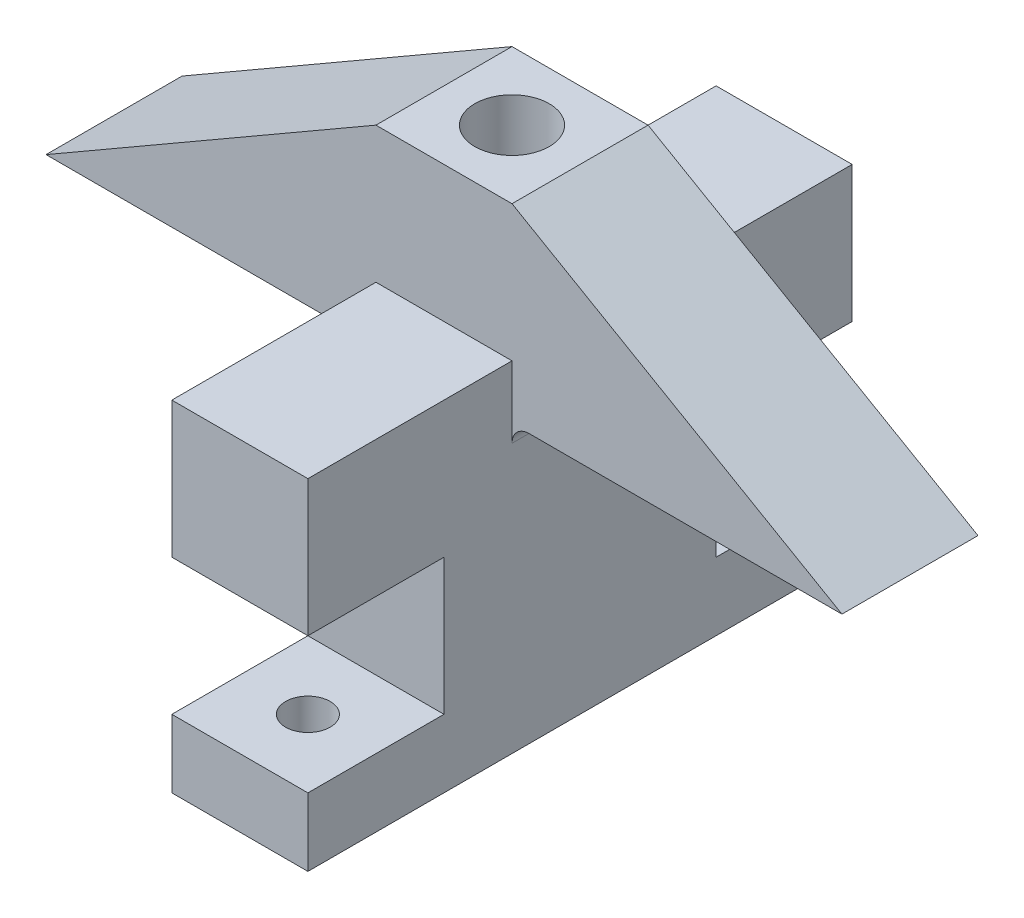
ISO-10303-21;
HEADER;
FILE_DESCRIPTION(('STEP AP214'),'2;1');
FILE_NAME('part.step','',(''),(''),'','','');
FILE_SCHEMA(('AUTOMOTIVE_DESIGN { 1 0 10303 214 1 1 1 1 }'));
ENDSEC;
DATA;
#1=APPLICATION_CONTEXT('core data for automotive mechanical design processes');
#2=APPLICATION_PROTOCOL_DEFINITION('international standard','automotive_design',2000,#1);
#3=PRODUCT_CONTEXT('',#1,'mechanical');
#4=PRODUCT('Part','Part','',(#3));
#5=PRODUCT_RELATED_PRODUCT_CATEGORY('part','',(#4));
#6=PRODUCT_DEFINITION_FORMATION('','',#4);
#7=PRODUCT_DEFINITION_CONTEXT('part definition',#1,'design');
#8=PRODUCT_DEFINITION('design','',#6,#7);
#9=PRODUCT_DEFINITION_SHAPE('','',#8);
#10=(LENGTH_UNIT() NAMED_UNIT(*) SI_UNIT(.MILLI.,.METRE.));
#11=(NAMED_UNIT(*) PLANE_ANGLE_UNIT() SI_UNIT($,.RADIAN.));
#12=(NAMED_UNIT(*) SI_UNIT($,.STERADIAN.) SOLID_ANGLE_UNIT());
#13=UNCERTAINTY_MEASURE_WITH_UNIT(LENGTH_MEASURE(1.E-05),#10,'distance_accuracy_value','');
#14=(GEOMETRIC_REPRESENTATION_CONTEXT(3) GLOBAL_UNCERTAINTY_ASSIGNED_CONTEXT((#13)) GLOBAL_UNIT_ASSIGNED_CONTEXT((#10,
#11,#12)) REPRESENTATION_CONTEXT('',''));
#15=CARTESIAN_POINT('',(0.,0.,0.));
#16=DIRECTION('',(0.,0.,1.));
#17=DIRECTION('',(1.,0.,0.));
#18=AXIS2_PLACEMENT_3D('',#15,#16,#17);
#19=CARTESIAN_POINT('',(0.,0.,0.));
#20=DIRECTION('',(0.,0.,-1.));
#21=DIRECTION('',(-1.,0.,0.));
#22=AXIS2_PLACEMENT_3D('',#19,#20,#21);
#23=PLANE('',#22);
#24=DIRECTION('',(-1.,0.,0.));
#25=VECTOR('',#24,1.);
#26=CARTESIAN_POINT('',(0.,63.5,0.));
#27=LINE('',#26,#25);
#28=CARTESIAN_POINT('',(25.4,63.5,0.));
#29=VERTEX_POINT('',#28);
#30=CARTESIAN_POINT('',(0.,63.5,0.));
#31=VERTEX_POINT('',#30);
#32=EDGE_CURVE('E59',#29,#31,#27,.T.);
#33=ORIENTED_EDGE('',*,*,#32,.T.);
#34=DIRECTION('',(0.,1.,0.));
#35=VECTOR('',#34,1.);
#36=CARTESIAN_POINT('',(0.,0.,0.));
#37=LINE('',#36,#35);
#38=CARTESIAN_POINT('',(0.,50.165,0.));
#39=VERTEX_POINT('',#38);
#40=EDGE_CURVE('E212',#39,#31,#37,.T.);
#41=ORIENTED_EDGE('',*,*,#40,.F.);
#42=CARTESIAN_POINT('',(-3.175,50.165,0.));
#43=DIRECTION('',(0.,0.,-1.));
#44=DIRECTION('',(-1.,0.,0.));
#45=AXIS2_PLACEMENT_3D('',#42,#43,#44);
#46=CIRCLE('',#45,3.175);
#47=CARTESIAN_POINT('',(-3.175,53.34,0.));
#48=VERTEX_POINT('',#47);
#49=EDGE_CURVE('E52',#39,#48,#46,.F.);
#50=ORIENTED_EDGE('',*,*,#49,.T.);
#51=DIRECTION('',(1.,0.,0.));
#52=VECTOR('',#51,1.);
#53=CARTESIAN_POINT('',(0.,53.34,0.));
#54=LINE('',#53,#52);
#55=CARTESIAN_POINT('',(-61.5917267171501,53.34,0.));
#56=VERTEX_POINT('',#55);
#57=EDGE_CURVE('E381',#56,#48,#54,.T.);
#58=ORIENTED_EDGE('',*,*,#57,.F.);
#59=DIRECTION('',(-0.866025403784441,-0.499999999999995,0.));
#60=VECTOR('',#59,1.);
#61=CARTESIAN_POINT('',(-61.5917267171501,53.34,0.));
#62=LINE('',#61,#60);
#63=CARTESIAN_POINT('',(0.,88.9,0.));
#64=VERTEX_POINT('',#63);
#65=EDGE_CURVE('E403',#64,#56,#62,.T.);
#66=ORIENTED_EDGE('',*,*,#65,.F.);
#67=DIRECTION('',(-1.,0.,0.));
#68=VECTOR('',#67,1.);
#69=CARTESIAN_POINT('',(0.,88.9,0.));
#70=LINE('',#69,#68);
#71=CARTESIAN_POINT('',(25.4,88.9,0.));
#72=VERTEX_POINT('',#71);
#73=EDGE_CURVE('E400',#72,#64,#70,.T.);
#74=ORIENTED_EDGE('',*,*,#73,.F.);
#75=DIRECTION('',(-0.866025403784442,0.499999999999995,0.));
#76=VECTOR('',#75,1.);
#77=CARTESIAN_POINT('',(25.4,88.9,0.));
#78=LINE('',#77,#76);
#79=CARTESIAN_POINT('',(86.9917267171501,53.34,0.));
#80=VERTEX_POINT('',#79);
#81=EDGE_CURVE('E397',#80,#72,#78,.T.);
#82=ORIENTED_EDGE('',*,*,#81,.F.);
#83=DIRECTION('',(1.,0.,0.));
#84=VECTOR('',#83,1.);
#85=CARTESIAN_POINT('',(86.9917267171501,53.34,0.));
#86=LINE('',#85,#84);
#87=CARTESIAN_POINT('',(28.575,53.34,0.));
#88=VERTEX_POINT('',#87);
#89=EDGE_CURVE('E376',#88,#80,#86,.T.);
#90=ORIENTED_EDGE('',*,*,#89,.F.);
#91=CARTESIAN_POINT('',(28.575,50.165,0.));
#92=DIRECTION('',(0.,0.,-1.));
#93=DIRECTION('',(-1.,0.,0.));
#94=AXIS2_PLACEMENT_3D('',#91,#92,#93);
#95=CIRCLE('',#94,3.175);
#96=CARTESIAN_POINT('',(25.4,50.165,0.));
#97=VERTEX_POINT('',#96);
#98=EDGE_CURVE('E444',#88,#97,#95,.F.);
#99=ORIENTED_EDGE('',*,*,#98,.T.);
#100=DIRECTION('',(0.,1.,0.));
#101=VECTOR('',#100,1.);
#102=CARTESIAN_POINT('',(25.4,0.,0.));
#103=LINE('',#102,#101);
#104=EDGE_CURVE('E64',#97,#29,#103,.T.);
#105=ORIENTED_EDGE('',*,*,#104,.T.);
#106=EDGE_LOOP('',(#33,#41,#50,#58,#66,#74,#82,#90,#99,#105));
#107=FACE_BOUND('',#106,.T.);
#108=ADVANCED_FACE('F43',(#107),#23,.T.);
#109=CARTESIAN_POINT('',(0.,0.,25.4));
#110=DIRECTION('',(0.,0.,-1.));
#111=DIRECTION('',(-1.,0.,0.));
#112=AXIS2_PLACEMENT_3D('',#109,#110,#111);
#113=PLANE('',#112);
#114=DIRECTION('',(0.,-1.,0.));
#115=VECTOR('',#114,1.);
#116=CARTESIAN_POINT('',(0.,0.,25.4));
#117=LINE('',#116,#115);
#118=CARTESIAN_POINT('',(0.,63.5,25.4));
#119=VERTEX_POINT('',#118);
#120=CARTESIAN_POINT('',(0.,50.165,25.4));
#121=VERTEX_POINT('',#120);
#122=EDGE_CURVE('E254',#119,#121,#117,.T.);
#123=ORIENTED_EDGE('',*,*,#122,.F.);
#124=DIRECTION('',(1.,0.,0.));
#125=VECTOR('',#124,1.);
#126=CARTESIAN_POINT('',(0.,63.5,25.4));
#127=LINE('',#126,#125);
#128=CARTESIAN_POINT('',(25.4,63.5,25.4));
#129=VERTEX_POINT('',#128);
#130=EDGE_CURVE('E260',#119,#129,#127,.T.);
#131=ORIENTED_EDGE('',*,*,#130,.T.);
#132=DIRECTION('',(0.,1.,0.));
#133=VECTOR('',#132,1.);
#134=CARTESIAN_POINT('',(25.4,0.,25.4));
#135=LINE('',#134,#133);
#136=CARTESIAN_POINT('',(25.4,50.165,25.4));
#137=VERTEX_POINT('',#136);
#138=EDGE_CURVE('E274',#137,#129,#135,.T.);
#139=ORIENTED_EDGE('',*,*,#138,.F.);
#140=CARTESIAN_POINT('',(28.575,50.165,25.4));
#141=DIRECTION('',(0.,0.,-1.));
#142=DIRECTION('',(-1.,0.,0.));
#143=AXIS2_PLACEMENT_3D('',#140,#141,#142);
#144=CIRCLE('',#143,3.175);
#145=CARTESIAN_POINT('',(28.575,53.34,25.4));
#146=VERTEX_POINT('',#145);
#147=EDGE_CURVE('E447',#137,#146,#144,.T.);
#148=ORIENTED_EDGE('',*,*,#147,.T.);
#149=DIRECTION('',(1.,0.,0.));
#150=VECTOR('',#149,1.);
#151=CARTESIAN_POINT('',(86.9917267171501,53.34,25.4));
#152=LINE('',#151,#150);
#153=CARTESIAN_POINT('',(86.9917267171501,53.34,25.4));
#154=VERTEX_POINT('',#153);
#155=EDGE_CURVE('E377',#146,#154,#152,.T.);
#156=ORIENTED_EDGE('',*,*,#155,.T.);
#157=DIRECTION('',(-0.866025403784442,0.499999999999995,0.));
#158=VECTOR('',#157,1.);
#159=CARTESIAN_POINT('',(25.4,88.9,25.4));
#160=LINE('',#159,#158);
#161=CARTESIAN_POINT('',(25.4,88.9,25.4));
#162=VERTEX_POINT('',#161);
#163=EDGE_CURVE('E380',#154,#162,#160,.T.);
#164=ORIENTED_EDGE('',*,*,#163,.T.);
#165=DIRECTION('',(-1.,0.,0.));
#166=VECTOR('',#165,1.);
#167=CARTESIAN_POINT('',(0.,88.9,25.4));
#168=LINE('',#167,#166);
#169=CARTESIAN_POINT('',(0.,88.9,25.4));
#170=VERTEX_POINT('',#169);
#171=EDGE_CURVE('E384',#162,#170,#168,.T.);
#172=ORIENTED_EDGE('',*,*,#171,.T.);
#173=DIRECTION('',(-0.866025403784441,-0.499999999999995,0.));
#174=VECTOR('',#173,1.);
#175=CARTESIAN_POINT('',(-61.5917267171501,53.34,25.4));
#176=LINE('',#175,#174);
#177=CARTESIAN_POINT('',(-61.5917267171501,53.34,25.4));
#178=VERTEX_POINT('',#177);
#179=EDGE_CURVE('E387',#170,#178,#176,.T.);
#180=ORIENTED_EDGE('',*,*,#179,.T.);
#181=DIRECTION('',(1.,0.,0.));
#182=VECTOR('',#181,1.);
#183=CARTESIAN_POINT('',(0.,53.34,25.4));
#184=LINE('',#183,#182);
#185=CARTESIAN_POINT('',(-3.175,53.34,25.4));
#186=VERTEX_POINT('',#185);
#187=EDGE_CURVE('E390',#178,#186,#184,.T.);
#188=ORIENTED_EDGE('',*,*,#187,.T.);
#189=CARTESIAN_POINT('',(-3.175,50.165,25.4));
#190=DIRECTION('',(0.,0.,-1.));
#191=DIRECTION('',(-1.,0.,0.));
#192=AXIS2_PLACEMENT_3D('',#189,#190,#191);
#193=CIRCLE('',#192,3.175);
#194=EDGE_CURVE('E11',#186,#121,#193,.T.);
#195=ORIENTED_EDGE('',*,*,#194,.T.);
#196=EDGE_LOOP('',(#123,#131,#139,#148,#156,#164,#172,#180,#188,#195));
#197=FACE_BOUND('',#196,.T.);
#198=ADVANCED_FACE('F462',(#197),#113,.F.);
#199=CARTESIAN_POINT('',(25.4,0.,25.4));
#200=DIRECTION('',(0.,1.,0.));
#201=DIRECTION('',(0.,0.,1.));
#202=AXIS2_PLACEMENT_3D('',#199,#200,#201);
#203=PLANE('',#202);
#204=CARTESIAN_POINT('',(12.7,0.,-25.4));
#205=DIRECTION('',(0.,1.,0.));
#206=DIRECTION('',(0.,0.,1.));
#207=AXIS2_PLACEMENT_3D('',#204,#205,#206);
#208=CIRCLE('',#207,4.1656);
#209=CARTESIAN_POINT('',(12.7,0.,-21.2344));
#210=VERTEX_POINT('',#209);
#211=EDGE_CURVE('E320',#210,#210,#208,.T.);
#212=ORIENTED_EDGE('',*,*,#211,.T.);
#213=EDGE_LOOP('',(#212));
#214=FACE_BOUND('',#213,.T.);
#215=CARTESIAN_POINT('',(12.7,0.,50.8));
#216=DIRECTION('',(0.,1.,0.));
#217=DIRECTION('',(0.,0.,1.));
#218=AXIS2_PLACEMENT_3D('',#215,#216,#217);
#219=CIRCLE('',#218,4.1656);
#220=CARTESIAN_POINT('',(12.7,0.,54.9656));
#221=VERTEX_POINT('',#220);
#222=EDGE_CURVE('E328',#221,#221,#219,.T.);
#223=ORIENTED_EDGE('',*,*,#222,.T.);
#224=EDGE_LOOP('',(#223));
#225=FACE_BOUND('',#224,.T.);
#226=DIRECTION('',(0.,0.,-1.));
#227=VECTOR('',#226,1.);
#228=CARTESIAN_POINT('',(0.,0.,25.4));
#229=LINE('',#228,#227);
#230=CARTESIAN_POINT('',(0.,0.,63.5));
#231=VERTEX_POINT('',#230);
#232=CARTESIAN_POINT('',(0.,0.,-38.1));
#233=VERTEX_POINT('',#232);
#234=EDGE_CURVE('E394',#231,#233,#229,.T.);
#235=ORIENTED_EDGE('',*,*,#234,.T.);
#236=DIRECTION('',(-1.,0.,0.));
#237=VECTOR('',#236,1.);
#238=CARTESIAN_POINT('',(25.4,0.,-38.1));
#239=LINE('',#238,#237);
#240=CARTESIAN_POINT('',(25.4,0.,-38.1));
#241=VERTEX_POINT('',#240);
#242=EDGE_CURVE('E336',#241,#233,#239,.T.);
#243=ORIENTED_EDGE('',*,*,#242,.F.);
#244=DIRECTION('',(0.,0.,-1.));
#245=VECTOR('',#244,1.);
#246=CARTESIAN_POINT('',(25.4,0.,25.4));
#247=LINE('',#246,#245);
#248=CARTESIAN_POINT('',(25.4,0.,63.5));
#249=VERTEX_POINT('',#248);
#250=EDGE_CURVE('E427',#249,#241,#247,.T.);
#251=ORIENTED_EDGE('',*,*,#250,.F.);
#252=DIRECTION('',(1.,0.,0.));
#253=VECTOR('',#252,1.);
#254=CARTESIAN_POINT('',(0.,0.,63.5));
#255=LINE('',#254,#253);
#256=EDGE_CURVE('E358',#231,#249,#255,.T.);
#257=ORIENTED_EDGE('',*,*,#256,.F.);
#258=EDGE_LOOP('',(#235,#243,#251,#257));
#259=FACE_BOUND('',#258,.T.);
#260=ADVANCED_FACE('F507',(#214,#225,#259),#203,.F.);
#261=CARTESIAN_POINT('',(25.4,53.34,25.4));
#262=DIRECTION('',(-1.,0.,0.));
#263=DIRECTION('',(0.,0.,1.));
#264=AXIS2_PLACEMENT_3D('',#261,#262,#263);
#265=PLANE('',#264);
#266=ORIENTED_EDGE('',*,*,#104,.F.);
#267=DIRECTION('',(0.,0.,-1.));
#268=VECTOR('',#267,1.);
#269=CARTESIAN_POINT('',(25.4,50.165,25.4));
#270=LINE('',#269,#268);
#271=EDGE_CURVE('E434',#97,#137,#270,.F.);
#272=ORIENTED_EDGE('',*,*,#271,.T.);
#273=ORIENTED_EDGE('',*,*,#138,.T.);
#274=DIRECTION('',(0.,0.,-1.));
#275=VECTOR('',#274,1.);
#276=CARTESIAN_POINT('',(25.4,63.5,63.5));
#277=LINE('',#276,#275);
#278=CARTESIAN_POINT('',(25.4,63.5,63.5));
#279=VERTEX_POINT('',#278);
#280=EDGE_CURVE('E283',#279,#129,#277,.T.);
#281=ORIENTED_EDGE('',*,*,#280,.F.);
#282=DIRECTION('',(0.,1.,0.));
#283=VECTOR('',#282,1.);
#284=CARTESIAN_POINT('',(25.4,0.,63.5));
#285=LINE('',#284,#283);
#286=CARTESIAN_POINT('',(25.4,38.1,63.5));
#287=VERTEX_POINT('',#286);
#288=EDGE_CURVE('E263',#287,#279,#285,.T.);
#289=ORIENTED_EDGE('',*,*,#288,.F.);
#290=DIRECTION('',(0.,0.,-1.));
#291=VECTOR('',#290,1.);
#292=CARTESIAN_POINT('',(25.4,38.1,63.5));
#293=LINE('',#292,#291);
#294=CARTESIAN_POINT('',(25.4,38.1,38.1));
#295=VERTEX_POINT('',#294);
#296=EDGE_CURVE('E287',#287,#295,#293,.T.);
#297=ORIENTED_EDGE('',*,*,#296,.T.);
#298=DIRECTION('',(0.,1.,0.));
#299=VECTOR('',#298,1.);
#300=CARTESIAN_POINT('',(25.4,0.,38.1));
#301=LINE('',#300,#299);
#302=CARTESIAN_POINT('',(25.4,12.7,38.1));
#303=VERTEX_POINT('',#302);
#304=EDGE_CURVE('E305',#303,#295,#301,.T.);
#305=ORIENTED_EDGE('',*,*,#304,.F.);
#306=DIRECTION('',(0.,0.,-1.));
#307=VECTOR('',#306,1.);
#308=CARTESIAN_POINT('',(25.4,12.7,63.5));
#309=LINE('',#308,#307);
#310=CARTESIAN_POINT('',(25.4,12.7,63.5));
#311=VERTEX_POINT('',#310);
#312=EDGE_CURVE('E372',#311,#303,#309,.T.);
#313=ORIENTED_EDGE('',*,*,#312,.F.);
#314=DIRECTION('',(0.,1.,0.));
#315=VECTOR('',#314,1.);
#316=CARTESIAN_POINT('',(25.4,0.,63.5));
#317=LINE('',#316,#315);
#318=EDGE_CURVE('E362',#249,#311,#317,.T.);
#319=ORIENTED_EDGE('',*,*,#318,.F.);
#320=ORIENTED_EDGE('',*,*,#250,.T.);
#321=DIRECTION('',(0.,-1.,0.));
#322=VECTOR('',#321,1.);
#323=CARTESIAN_POINT('',(25.4,0.,-38.1));
#324=LINE('',#323,#322);
#325=CARTESIAN_POINT('',(25.4,12.7,-38.1));
#326=VERTEX_POINT('',#325);
#327=EDGE_CURVE('E332',#326,#241,#324,.T.);
#328=ORIENTED_EDGE('',*,*,#327,.F.);
#329=DIRECTION('',(0.,0.,1.));
#330=VECTOR('',#329,1.);
#331=CARTESIAN_POINT('',(25.4,12.7,-38.1));
#332=LINE('',#331,#330);
#333=CARTESIAN_POINT('',(25.4,12.7,-12.7));
#334=VERTEX_POINT('',#333);
#335=EDGE_CURVE('E346',#326,#334,#332,.T.);
#336=ORIENTED_EDGE('',*,*,#335,.T.);
#337=DIRECTION('',(0.,-1.,0.));
#338=VECTOR('',#337,1.);
#339=CARTESIAN_POINT('',(25.4,0.,-12.7));
#340=LINE('',#339,#338);
#341=CARTESIAN_POINT('',(25.4,38.1,-12.7));
#342=VERTEX_POINT('',#341);
#343=EDGE_CURVE('E245',#342,#334,#340,.T.);
#344=ORIENTED_EDGE('',*,*,#343,.F.);
#345=DIRECTION('',(0.,0.,1.));
#346=VECTOR('',#345,1.);
#347=CARTESIAN_POINT('',(25.4,38.1,-38.1));
#348=LINE('',#347,#346);
#349=CARTESIAN_POINT('',(25.4,38.1,-38.1));
#350=VERTEX_POINT('',#349);
#351=EDGE_CURVE('E236',#350,#342,#348,.T.);
#352=ORIENTED_EDGE('',*,*,#351,.F.);
#353=DIRECTION('',(0.,1.,0.));
#354=VECTOR('',#353,1.);
#355=CARTESIAN_POINT('',(25.4,0.,-38.1));
#356=LINE('',#355,#354);
#357=CARTESIAN_POINT('',(25.4,63.5,-38.1));
#358=VERTEX_POINT('',#357);
#359=EDGE_CURVE('E220',#350,#358,#356,.T.);
#360=ORIENTED_EDGE('',*,*,#359,.T.);
#361=DIRECTION('',(0.,0.,1.));
#362=VECTOR('',#361,1.);
#363=CARTESIAN_POINT('',(25.4,63.5,-38.1));
#364=LINE('',#363,#362);
#365=EDGE_CURVE('E216',#358,#29,#364,.T.);
#366=ORIENTED_EDGE('',*,*,#365,.T.);
#367=EDGE_LOOP('',(#266,#272,#273,#281,#289,#297,#305,#313,#319,#320,#328,#336,#344,#352,#360,#366));
#368=FACE_BOUND('',#367,.T.);
#369=ADVANCED_FACE('F487',(#368),#265,.F.);
#370=CARTESIAN_POINT('',(86.9917267171501,53.34,25.4));
#371=DIRECTION('',(0.,1.,0.));
#372=DIRECTION('',(-1.,0.,0.));
#373=AXIS2_PLACEMENT_3D('',#370,#371,#372);
#374=PLANE('',#373);
#375=ORIENTED_EDGE('',*,*,#155,.F.);
#376=DIRECTION('',(0.,0.,-1.));
#377=VECTOR('',#376,1.);
#378=CARTESIAN_POINT('',(28.575,53.34,0.));
#379=LINE('',#378,#377);
#380=EDGE_CURVE('E430',#146,#88,#379,.T.);
#381=ORIENTED_EDGE('',*,*,#380,.T.);
#382=ORIENTED_EDGE('',*,*,#89,.T.);
#383=DIRECTION('',(0.,0.,-1.));
#384=VECTOR('',#383,1.);
#385=CARTESIAN_POINT('',(86.9917267171501,53.34,25.4));
#386=LINE('',#385,#384);
#387=EDGE_CURVE('E423',#154,#80,#386,.T.);
#388=ORIENTED_EDGE('',*,*,#387,.F.);
#389=EDGE_LOOP('',(#375,#381,#382,#388));
#390=FACE_BOUND('',#389,.T.);
#391=ADVANCED_FACE('F480',(#390),#374,.F.);
#392=CARTESIAN_POINT('',(25.4,88.9,25.4));
#393=DIRECTION('',(-0.499999999999995,-0.866025403784442,0.));
#394=DIRECTION('',(0.866025403784442,-0.499999999999995,0.));
#395=AXIS2_PLACEMENT_3D('',#392,#393,#394);
#396=PLANE('',#395);
#397=ORIENTED_EDGE('',*,*,#81,.T.);
#398=DIRECTION('',(0.,0.,-1.));
#399=VECTOR('',#398,1.);
#400=CARTESIAN_POINT('',(25.4,88.9,25.4));
#401=LINE('',#400,#399);
#402=EDGE_CURVE('E419',#162,#72,#401,.T.);
#403=ORIENTED_EDGE('',*,*,#402,.F.);
#404=ORIENTED_EDGE('',*,*,#163,.F.);
#405=ORIENTED_EDGE('',*,*,#387,.T.);
#406=EDGE_LOOP('',(#397,#403,#404,#405));
#407=FACE_BOUND('',#406,.T.);
#408=ADVANCED_FACE('F476',(#407),#396,.F.);
#409=CARTESIAN_POINT('',(0.,88.9,25.4));
#410=DIRECTION('',(0.,-1.,0.));
#411=DIRECTION('',(0.,0.,-1.));
#412=AXIS2_PLACEMENT_3D('',#409,#410,#411);
#413=PLANE('',#412);
#414=CARTESIAN_POINT('',(12.7,88.9,12.7));
#415=DIRECTION('',(0.,1.,0.));
#416=DIRECTION('',(0.,0.,1.));
#417=AXIS2_PLACEMENT_3D('',#414,#415,#416);
#418=CIRCLE('',#417,6.94689999999999);
#419=CARTESIAN_POINT('',(12.7,88.9,19.6469));
#420=VERTEX_POINT('',#419);
#421=EDGE_CURVE('E308',#420,#420,#418,.T.);
#422=ORIENTED_EDGE('',*,*,#421,.F.);
#423=EDGE_LOOP('',(#422));
#424=FACE_BOUND('',#423,.T.);
#425=ORIENTED_EDGE('',*,*,#73,.T.);
#426=DIRECTION('',(0.,0.,-1.));
#427=VECTOR('',#426,1.);
#428=CARTESIAN_POINT('',(0.,88.9,25.4));
#429=LINE('',#428,#427);
#430=EDGE_CURVE('E415',#170,#64,#429,.T.);
#431=ORIENTED_EDGE('',*,*,#430,.F.);
#432=ORIENTED_EDGE('',*,*,#171,.F.);
#433=ORIENTED_EDGE('',*,*,#402,.T.);
#434=EDGE_LOOP('',(#425,#431,#432,#433));
#435=FACE_BOUND('',#434,.T.);
#436=ADVANCED_FACE('F472',(#424,#435),#413,.F.);
#437=CARTESIAN_POINT('',(-61.5917267171501,53.34,25.4));
#438=DIRECTION('',(0.499999999999995,-0.866025403784441,0.));
#439=DIRECTION('',(0.866025403784442,0.499999999999995,0.));
#440=AXIS2_PLACEMENT_3D('',#437,#438,#439);
#441=PLANE('',#440);
#442=ORIENTED_EDGE('',*,*,#65,.T.);
#443=DIRECTION('',(0.,0.,-1.));
#444=VECTOR('',#443,1.);
#445=CARTESIAN_POINT('',(-61.5917267171501,53.34,25.4));
#446=LINE('',#445,#444);
#447=EDGE_CURVE('E411',#178,#56,#446,.T.);
#448=ORIENTED_EDGE('',*,*,#447,.F.);
#449=ORIENTED_EDGE('',*,*,#179,.F.);
#450=ORIENTED_EDGE('',*,*,#430,.T.);
#451=EDGE_LOOP('',(#442,#448,#449,#450));
#452=FACE_BOUND('',#451,.T.);
#453=ADVANCED_FACE('F467',(#452),#441,.F.);
#454=CARTESIAN_POINT('',(0.,53.34,25.4));
#455=DIRECTION('',(0.,1.,0.));
#456=DIRECTION('',(-1.,0.,0.));
#457=AXIS2_PLACEMENT_3D('',#454,#455,#456);
#458=PLANE('',#457);
#459=ORIENTED_EDGE('',*,*,#57,.T.);
#460=DIRECTION('',(0.,0.,-1.));
#461=VECTOR('',#460,1.);
#462=CARTESIAN_POINT('',(-3.175,53.34,25.4));
#463=LINE('',#462,#461);
#464=EDGE_CURVE('E441',#48,#186,#463,.F.);
#465=ORIENTED_EDGE('',*,*,#464,.T.);
#466=ORIENTED_EDGE('',*,*,#187,.F.);
#467=ORIENTED_EDGE('',*,*,#447,.T.);
#468=EDGE_LOOP('',(#459,#465,#466,#467));
#469=FACE_BOUND('',#468,.T.);
#470=ADVANCED_FACE('F457',(#469),#458,.F.);
#471=CARTESIAN_POINT('',(0.,0.,25.4));
#472=DIRECTION('',(1.,0.,0.));
#473=DIRECTION('',(0.,0.,-1.));
#474=AXIS2_PLACEMENT_3D('',#471,#472,#473);
#475=PLANE('',#474);
#476=DIRECTION('',(0.,0.,-1.));
#477=VECTOR('',#476,1.);
#478=CARTESIAN_POINT('',(0.,50.165,0.));
#479=LINE('',#478,#477);
#480=EDGE_CURVE('E438',#121,#39,#479,.T.);
#481=ORIENTED_EDGE('',*,*,#480,.T.);
#482=ORIENTED_EDGE('',*,*,#40,.T.);
#483=DIRECTION('',(0.,0.,1.));
#484=VECTOR('',#483,1.);
#485=CARTESIAN_POINT('',(0.,63.5,-38.1));
#486=LINE('',#485,#484);
#487=CARTESIAN_POINT('',(0.,63.5,-38.1));
#488=VERTEX_POINT('',#487);
#489=EDGE_CURVE('E209',#488,#31,#486,.T.);
#490=ORIENTED_EDGE('',*,*,#489,.F.);
#491=DIRECTION('',(0.,1.,0.));
#492=VECTOR('',#491,1.);
#493=CARTESIAN_POINT('',(0.,0.,-38.1));
#494=LINE('',#493,#492);
#495=CARTESIAN_POINT('',(0.,38.1,-38.1));
#496=VERTEX_POINT('',#495);
#497=EDGE_CURVE('E194',#496,#488,#494,.T.);
#498=ORIENTED_EDGE('',*,*,#497,.F.);
#499=DIRECTION('',(0.,0.,1.));
#500=VECTOR('',#499,1.);
#501=CARTESIAN_POINT('',(0.,38.1,-38.1));
#502=LINE('',#501,#500);
#503=CARTESIAN_POINT('',(0.,38.1,-12.7));
#504=VERTEX_POINT('',#503);
#505=EDGE_CURVE('E227',#496,#504,#502,.T.);
#506=ORIENTED_EDGE('',*,*,#505,.T.);
#507=DIRECTION('',(0.,1.,0.));
#508=VECTOR('',#507,1.);
#509=CARTESIAN_POINT('',(0.,0.,-12.7));
#510=LINE('',#509,#508);
#511=CARTESIAN_POINT('',(0.,12.7,-12.7));
#512=VERTEX_POINT('',#511);
#513=EDGE_CURVE('E251',#512,#504,#510,.T.);
#514=ORIENTED_EDGE('',*,*,#513,.F.);
#515=DIRECTION('',(0.,0.,1.));
#516=VECTOR('',#515,1.);
#517=CARTESIAN_POINT('',(0.,12.7,-38.1));
#518=LINE('',#517,#516);
#519=CARTESIAN_POINT('',(0.,12.7,-38.1));
#520=VERTEX_POINT('',#519);
#521=EDGE_CURVE('E350',#520,#512,#518,.T.);
#522=ORIENTED_EDGE('',*,*,#521,.F.);
#523=DIRECTION('',(0.,1.,0.));
#524=VECTOR('',#523,1.);
#525=CARTESIAN_POINT('',(0.,0.,-38.1));
#526=LINE('',#525,#524);
#527=EDGE_CURVE('E340',#233,#520,#526,.T.);
#528=ORIENTED_EDGE('',*,*,#527,.F.);
#529=ORIENTED_EDGE('',*,*,#234,.F.);
#530=DIRECTION('',(0.,-1.,0.));
#531=VECTOR('',#530,1.);
#532=CARTESIAN_POINT('',(0.,0.,63.5));
#533=LINE('',#532,#531);
#534=CARTESIAN_POINT('',(0.,12.7,63.5));
#535=VERTEX_POINT('',#534);
#536=EDGE_CURVE('E354',#535,#231,#533,.T.);
#537=ORIENTED_EDGE('',*,*,#536,.F.);
#538=DIRECTION('',(0.,0.,-1.));
#539=VECTOR('',#538,1.);
#540=CARTESIAN_POINT('',(0.,12.7,63.5));
#541=LINE('',#540,#539);
#542=CARTESIAN_POINT('',(0.,12.7,38.1));
#543=VERTEX_POINT('',#542);
#544=EDGE_CURVE('E368',#535,#543,#541,.T.);
#545=ORIENTED_EDGE('',*,*,#544,.T.);
#546=DIRECTION('',(0.,-1.,0.));
#547=VECTOR('',#546,1.);
#548=CARTESIAN_POINT('',(0.,0.,38.1));
#549=LINE('',#548,#547);
#550=CARTESIAN_POINT('',(0.,38.1,38.1));
#551=VERTEX_POINT('',#550);
#552=EDGE_CURVE('E299',#551,#543,#549,.T.);
#553=ORIENTED_EDGE('',*,*,#552,.F.);
#554=DIRECTION('',(0.,0.,-1.));
#555=VECTOR('',#554,1.);
#556=CARTESIAN_POINT('',(0.,38.1,63.5));
#557=LINE('',#556,#555);
#558=CARTESIAN_POINT('',(0.,38.1,63.5));
#559=VERTEX_POINT('',#558);
#560=EDGE_CURVE('E291',#559,#551,#557,.T.);
#561=ORIENTED_EDGE('',*,*,#560,.F.);
#562=DIRECTION('',(0.,-1.,0.));
#563=VECTOR('',#562,1.);
#564=CARTESIAN_POINT('',(0.,0.,63.5));
#565=LINE('',#564,#563);
#566=CARTESIAN_POINT('',(0.,63.5,63.5));
#567=VERTEX_POINT('',#566);
#568=EDGE_CURVE('E255',#567,#559,#565,.T.);
#569=ORIENTED_EDGE('',*,*,#568,.F.);
#570=DIRECTION('',(0.,0.,-1.));
#571=VECTOR('',#570,1.);
#572=CARTESIAN_POINT('',(0.,63.5,63.5));
#573=LINE('',#572,#571);
#574=EDGE_CURVE('E270',#567,#119,#573,.T.);
#575=ORIENTED_EDGE('',*,*,#574,.T.);
#576=ORIENTED_EDGE('',*,*,#122,.T.);
#577=EDGE_LOOP('',(#481,#482,#490,#498,#506,#514,#522,#528,#529,#537,#545,#553,#561,#569,#575,#576));
#578=FACE_BOUND('',#577,.T.);
#579=ADVANCED_FACE('F211',(#578),#475,.F.);
#580=CARTESIAN_POINT('',(0.,12.7,63.5));
#581=DIRECTION('',(0.,-1.,0.));
#582=DIRECTION('',(0.,0.,-1.));
#583=AXIS2_PLACEMENT_3D('',#580,#581,#582);
#584=PLANE('',#583);
#585=CARTESIAN_POINT('',(12.7,12.7,50.8));
#586=DIRECTION('',(0.,1.,0.));
#587=DIRECTION('',(0.,0.,1.));
#588=AXIS2_PLACEMENT_3D('',#585,#586,#587);
#589=CIRCLE('',#588,4.1656);
#590=CARTESIAN_POINT('',(12.7,12.7,54.9656));
#591=VERTEX_POINT('',#590);
#592=EDGE_CURVE('E324',#591,#591,#589,.T.);
#593=ORIENTED_EDGE('',*,*,#592,.F.);
#594=EDGE_LOOP('',(#593));
#595=FACE_BOUND('',#594,.T.);
#596=ORIENTED_EDGE('',*,*,#312,.T.);
#597=DIRECTION('',(1.,0.,0.));
#598=VECTOR('',#597,1.);
#599=CARTESIAN_POINT('',(0.,12.7,38.1));
#600=LINE('',#599,#598);
#601=EDGE_CURVE('E302',#543,#303,#600,.T.);
#602=ORIENTED_EDGE('',*,*,#601,.F.);
#603=ORIENTED_EDGE('',*,*,#544,.F.);
#604=DIRECTION('',(-1.,0.,0.));
#605=VECTOR('',#604,1.);
#606=CARTESIAN_POINT('',(0.,12.7,63.5));
#607=LINE('',#606,#605);
#608=EDGE_CURVE('E365',#311,#535,#607,.T.);
#609=ORIENTED_EDGE('',*,*,#608,.F.);
#610=EDGE_LOOP('',(#596,#602,#603,#609));
#611=FACE_BOUND('',#610,.T.);
#612=ADVANCED_FACE('F516',(#595,#611),#584,.F.);
#613=CARTESIAN_POINT('',(0.,0.,63.5));
#614=DIRECTION('',(0.,0.,-1.));
#615=DIRECTION('',(-1.,0.,0.));
#616=AXIS2_PLACEMENT_3D('',#613,#614,#615);
#617=PLANE('',#616);
#618=ORIENTED_EDGE('',*,*,#536,.T.);
#619=ORIENTED_EDGE('',*,*,#256,.T.);
#620=ORIENTED_EDGE('',*,*,#318,.T.);
#621=ORIENTED_EDGE('',*,*,#608,.T.);
#622=EDGE_LOOP('',(#618,#619,#620,#621));
#623=FACE_BOUND('',#622,.T.);
#624=ADVANCED_FACE('F510',(#623),#617,.F.);
#625=CARTESIAN_POINT('',(25.4,12.7,-38.1));
#626=DIRECTION('',(0.,-1.,0.));
#627=DIRECTION('',(0.,0.,-1.));
#628=AXIS2_PLACEMENT_3D('',#625,#626,#627);
#629=PLANE('',#628);
#630=CARTESIAN_POINT('',(12.7,12.7,-25.4));
#631=DIRECTION('',(0.,1.,0.));
#632=DIRECTION('',(0.,0.,1.));
#633=AXIS2_PLACEMENT_3D('',#630,#631,#632);
#634=CIRCLE('',#633,4.1656);
#635=CARTESIAN_POINT('',(12.7,12.7,-21.2344));
#636=VERTEX_POINT('',#635);
#637=EDGE_CURVE('E316',#636,#636,#634,.T.);
#638=ORIENTED_EDGE('',*,*,#637,.F.);
#639=EDGE_LOOP('',(#638));
#640=FACE_BOUND('',#639,.T.);
#641=ORIENTED_EDGE('',*,*,#521,.T.);
#642=DIRECTION('',(-1.,0.,0.));
#643=VECTOR('',#642,1.);
#644=CARTESIAN_POINT('',(0.,12.7,-12.7));
#645=LINE('',#644,#643);
#646=EDGE_CURVE('E248',#334,#512,#645,.T.);
#647=ORIENTED_EDGE('',*,*,#646,.F.);
#648=ORIENTED_EDGE('',*,*,#335,.F.);
#649=DIRECTION('',(1.,0.,0.));
#650=VECTOR('',#649,1.);
#651=CARTESIAN_POINT('',(25.4,12.7,-38.1));
#652=LINE('',#651,#650);
#653=EDGE_CURVE('E343',#520,#326,#652,.T.);
#654=ORIENTED_EDGE('',*,*,#653,.F.);
#655=EDGE_LOOP('',(#641,#647,#648,#654));
#656=FACE_BOUND('',#655,.T.);
#657=ADVANCED_FACE('F498',(#640,#656),#629,.F.);
#658=CARTESIAN_POINT('',(0.,0.,-38.1));
#659=DIRECTION('',(0.,0.,1.));
#660=DIRECTION('',(1.,0.,0.));
#661=AXIS2_PLACEMENT_3D('',#658,#659,#660);
#662=PLANE('',#661);
#663=ORIENTED_EDGE('',*,*,#327,.T.);
#664=ORIENTED_EDGE('',*,*,#242,.T.);
#665=ORIENTED_EDGE('',*,*,#527,.T.);
#666=ORIENTED_EDGE('',*,*,#653,.T.);
#667=EDGE_LOOP('',(#663,#664,#665,#666));
#668=FACE_BOUND('',#667,.T.);
#669=ADVANCED_FACE('F502',(#668),#662,.F.);
#670=CARTESIAN_POINT('',(12.7,12.7,50.8));
#671=DIRECTION('',(0.,1.,0.));
#672=DIRECTION('',(0.,0.,1.));
#673=AXIS2_PLACEMENT_3D('',#670,#671,#672);
#674=CYLINDRICAL_SURFACE('',#673,4.1656);
#675=ORIENTED_EDGE('',*,*,#222,.F.);
#676=EDGE_LOOP('',(#675));
#677=FACE_BOUND('',#676,.T.);
#678=ORIENTED_EDGE('',*,*,#592,.T.);
#679=EDGE_LOOP('',(#678));
#680=FACE_BOUND('',#679,.T.);
#681=ADVANCED_FACE('F589',(#677,#680),#674,.F.);
#682=CARTESIAN_POINT('',(12.7,12.7,-25.4));
#683=DIRECTION('',(0.,1.,0.));
#684=DIRECTION('',(0.,0.,1.));
#685=AXIS2_PLACEMENT_3D('',#682,#683,#684);
#686=CYLINDRICAL_SURFACE('',#685,4.1656);
#687=ORIENTED_EDGE('',*,*,#211,.F.);
#688=EDGE_LOOP('',(#687));
#689=FACE_BOUND('',#688,.T.);
#690=ORIENTED_EDGE('',*,*,#637,.T.);
#691=EDGE_LOOP('',(#690));
#692=FACE_BOUND('',#691,.T.);
#693=ADVANCED_FACE('F580',(#689,#692),#686,.F.);
#694=CARTESIAN_POINT('',(12.7,53.848,12.7));
#695=DIRECTION('',(0.,1.,0.));
#696=DIRECTION('',(0.,0.,1.));
#697=AXIS2_PLACEMENT_3D('',#694,#695,#696);
#698=CONICAL_SURFACE('',#697,6.94689999999999,1.02974425867665);
#699=CARTESIAN_POINT('',(12.7,49.6738813656774,12.7));
#700=VERTEX_POINT('',#699);
#701=VERTEX_LOOP('',#700);
#702=FACE_BOUND('',#701,.T.);
#703=CARTESIAN_POINT('',(12.7,53.848,12.7));
#704=DIRECTION('',(0.,1.,0.));
#705=DIRECTION('',(0.,0.,1.));
#706=AXIS2_PLACEMENT_3D('',#703,#704,#705);
#707=CIRCLE('',#706,6.94689999999999);
#708=CARTESIAN_POINT('',(12.7,53.848,19.6469));
#709=VERTEX_POINT('',#708);
#710=EDGE_CURVE('E312',#709,#709,#707,.T.);
#711=ORIENTED_EDGE('',*,*,#710,.T.);
#712=EDGE_LOOP('',(#711));
#713=FACE_BOUND('',#712,.T.);
#714=ADVANCED_FACE('F574',(#702,#713),#698,.F.);
#715=CARTESIAN_POINT('',(12.7,88.9,12.7));
#716=DIRECTION('',(0.,1.,0.));
#717=DIRECTION('',(0.,0.,1.));
#718=AXIS2_PLACEMENT_3D('',#715,#716,#717);
#719=CYLINDRICAL_SURFACE('',#718,6.94689999999999);
#720=ORIENTED_EDGE('',*,*,#710,.F.);
#721=EDGE_LOOP('',(#720));
#722=FACE_BOUND('',#721,.T.);
#723=ORIENTED_EDGE('',*,*,#421,.T.);
#724=EDGE_LOOP('',(#723));
#725=FACE_BOUND('',#724,.T.);
#726=ADVANCED_FACE('F569',(#722,#725),#719,.F.);
#727=CARTESIAN_POINT('',(28.575,50.165,25.4));
#728=DIRECTION('',(0.,0.,1.));
#729=DIRECTION('',(1.,0.,0.));
#730=AXIS2_PLACEMENT_3D('',#727,#728,#729);
#731=CYLINDRICAL_SURFACE('',#730,3.175);
#732=ORIENTED_EDGE('',*,*,#147,.F.);
#733=ORIENTED_EDGE('',*,*,#271,.F.);
#734=ORIENTED_EDGE('',*,*,#98,.F.);
#735=ORIENTED_EDGE('',*,*,#380,.F.);
#736=EDGE_LOOP('',(#732,#733,#734,#735));
#737=FACE_BOUND('',#736,.T.);
#738=ADVANCED_FACE('F485',(#737),#731,.F.);
#739=CARTESIAN_POINT('',(-3.175,50.165,25.4));
#740=DIRECTION('',(0.,0.,1.));
#741=DIRECTION('',(1.,0.,0.));
#742=AXIS2_PLACEMENT_3D('',#739,#740,#741);
#743=CYLINDRICAL_SURFACE('',#742,3.175);
#744=ORIENTED_EDGE('',*,*,#194,.F.);
#745=ORIENTED_EDGE('',*,*,#464,.F.);
#746=ORIENTED_EDGE('',*,*,#49,.F.);
#747=ORIENTED_EDGE('',*,*,#480,.F.);
#748=EDGE_LOOP('',(#744,#745,#746,#747));
#749=FACE_BOUND('',#748,.T.);
#750=ADVANCED_FACE('F45',(#749),#743,.F.);
#751=CARTESIAN_POINT('',(0.,0.,38.1));
#752=DIRECTION('',(0.,0.,1.));
#753=DIRECTION('',(1.,0.,0.));
#754=AXIS2_PLACEMENT_3D('',#751,#752,#753);
#755=PLANE('',#754);
#756=DIRECTION('',(1.,0.,0.));
#757=VECTOR('',#756,1.);
#758=CARTESIAN_POINT('',(0.,38.1,38.1));
#759=LINE('',#758,#757);
#760=EDGE_CURVE('E295',#551,#295,#759,.T.);
#761=ORIENTED_EDGE('',*,*,#760,.F.);
#762=ORIENTED_EDGE('',*,*,#552,.T.);
#763=ORIENTED_EDGE('',*,*,#601,.T.);
#764=ORIENTED_EDGE('',*,*,#304,.T.);
#765=EDGE_LOOP('',(#761,#762,#763,#764));
#766=FACE_BOUND('',#765,.T.);
#767=ADVANCED_FACE('F521',(#766),#755,.T.);
#768=CARTESIAN_POINT('',(0.,38.1,63.5));
#769=DIRECTION('',(0.,1.,0.));
#770=DIRECTION('',(0.,0.,1.));
#771=AXIS2_PLACEMENT_3D('',#768,#769,#770);
#772=PLANE('',#771);
#773=ORIENTED_EDGE('',*,*,#760,.T.);
#774=ORIENTED_EDGE('',*,*,#296,.F.);
#775=DIRECTION('',(1.,0.,0.));
#776=VECTOR('',#775,1.);
#777=CARTESIAN_POINT('',(0.,38.1,63.5));
#778=LINE('',#777,#776);
#779=EDGE_CURVE('E259',#559,#287,#778,.T.);
#780=ORIENTED_EDGE('',*,*,#779,.F.);
#781=ORIENTED_EDGE('',*,*,#560,.T.);
#782=EDGE_LOOP('',(#773,#774,#780,#781));
#783=FACE_BOUND('',#782,.T.);
#784=ADVANCED_FACE('F525',(#783),#772,.F.);
#785=CARTESIAN_POINT('',(0.,63.5,63.5));
#786=DIRECTION('',(0.,1.,0.));
#787=DIRECTION('',(0.,0.,1.));
#788=AXIS2_PLACEMENT_3D('',#785,#786,#787);
#789=PLANE('',#788);
#790=ORIENTED_EDGE('',*,*,#130,.F.);
#791=ORIENTED_EDGE('',*,*,#574,.F.);
#792=DIRECTION('',(1.,0.,0.));
#793=VECTOR('',#792,1.);
#794=CARTESIAN_POINT('',(0.,63.5,63.5));
#795=LINE('',#794,#793);
#796=EDGE_CURVE('E266',#567,#279,#795,.T.);
#797=ORIENTED_EDGE('',*,*,#796,.T.);
#798=ORIENTED_EDGE('',*,*,#280,.T.);
#799=EDGE_LOOP('',(#790,#791,#797,#798));
#800=FACE_BOUND('',#799,.T.);
#801=ADVANCED_FACE('F532',(#800),#789,.T.);
#802=CARTESIAN_POINT('',(0.,0.,63.5));
#803=DIRECTION('',(0.,0.,1.));
#804=DIRECTION('',(1.,0.,0.));
#805=AXIS2_PLACEMENT_3D('',#802,#803,#804);
#806=PLANE('',#805);
#807=ORIENTED_EDGE('',*,*,#568,.T.);
#808=ORIENTED_EDGE('',*,*,#779,.T.);
#809=ORIENTED_EDGE('',*,*,#288,.T.);
#810=ORIENTED_EDGE('',*,*,#796,.F.);
#811=EDGE_LOOP('',(#807,#808,#809,#810));
#812=FACE_BOUND('',#811,.T.);
#813=ADVANCED_FACE('F529',(#812),#806,.T.);
#814=CARTESIAN_POINT('',(0.,0.,-12.7));
#815=DIRECTION('',(0.,0.,-1.));
#816=DIRECTION('',(-1.,0.,0.));
#817=AXIS2_PLACEMENT_3D('',#814,#815,#816);
#818=PLANE('',#817);
#819=DIRECTION('',(-1.,0.,0.));
#820=VECTOR('',#819,1.);
#821=CARTESIAN_POINT('',(0.,38.1,-12.7));
#822=LINE('',#821,#820);
#823=EDGE_CURVE('E215',#342,#504,#822,.T.);
#824=ORIENTED_EDGE('',*,*,#823,.F.);
#825=ORIENTED_EDGE('',*,*,#343,.T.);
#826=ORIENTED_EDGE('',*,*,#646,.T.);
#827=ORIENTED_EDGE('',*,*,#513,.T.);
#828=EDGE_LOOP('',(#824,#825,#826,#827));
#829=FACE_BOUND('',#828,.T.);
#830=ADVANCED_FACE('F540',(#829),#818,.T.);
#831=CARTESIAN_POINT('',(0.,63.5,-38.1));
#832=DIRECTION('',(0.,1.,0.));
#833=DIRECTION('',(0.,0.,1.));
#834=AXIS2_PLACEMENT_3D('',#831,#832,#833);
#835=PLANE('',#834);
#836=ORIENTED_EDGE('',*,*,#32,.F.);
#837=ORIENTED_EDGE('',*,*,#365,.F.);
#838=DIRECTION('',(-1.,0.,0.));
#839=VECTOR('',#838,1.);
#840=CARTESIAN_POINT('',(0.,63.5,-38.1));
#841=LINE('',#840,#839);
#842=EDGE_CURVE('E199',#358,#488,#841,.T.);
#843=ORIENTED_EDGE('',*,*,#842,.T.);
#844=ORIENTED_EDGE('',*,*,#489,.T.);
#845=EDGE_LOOP('',(#836,#837,#843,#844));
#846=FACE_BOUND('',#845,.T.);
#847=ADVANCED_FACE('F218',(#846),#835,.T.);
#848=CARTESIAN_POINT('',(0.,38.1,-38.1));
#849=DIRECTION('',(0.,1.,0.));
#850=DIRECTION('',(0.,0.,1.));
#851=AXIS2_PLACEMENT_3D('',#848,#849,#850);
#852=PLANE('',#851);
#853=ORIENTED_EDGE('',*,*,#823,.T.);
#854=ORIENTED_EDGE('',*,*,#505,.F.);
#855=DIRECTION('',(-1.,0.,0.));
#856=VECTOR('',#855,1.);
#857=CARTESIAN_POINT('',(0.,38.1,-38.1));
#858=LINE('',#857,#856);
#859=EDGE_CURVE('E202',#350,#496,#858,.T.);
#860=ORIENTED_EDGE('',*,*,#859,.F.);
#861=ORIENTED_EDGE('',*,*,#351,.T.);
#862=EDGE_LOOP('',(#853,#854,#860,#861));
#863=FACE_BOUND('',#862,.T.);
#864=ADVANCED_FACE('F490',(#863),#852,.F.);
#865=CARTESIAN_POINT('',(0.,0.,-38.1));
#866=DIRECTION('',(0.,0.,-1.));
#867=DIRECTION('',(-1.,0.,0.));
#868=AXIS2_PLACEMENT_3D('',#865,#866,#867);
#869=PLANE('',#868);
#870=ORIENTED_EDGE('',*,*,#497,.T.);
#871=ORIENTED_EDGE('',*,*,#842,.F.);
#872=ORIENTED_EDGE('',*,*,#359,.F.);
#873=ORIENTED_EDGE('',*,*,#859,.T.);
#874=EDGE_LOOP('',(#870,#871,#872,#873));
#875=FACE_BOUND('',#874,.T.);
#876=ADVANCED_FACE('F196',(#875),#869,.T.);
#877=CLOSED_SHELL('',(#108,#198,#260,#369,#391,#408,#436,#453,#470,#579,#612,#624,#657,#669,
#681,#693,#714,#726,#738,#750,#767,#784,#801,#813,#830,#847,#864,#876));
#878=MANIFOLD_SOLID_BREP('B2',#877);
#879=ADVANCED_BREP_SHAPE_REPRESENTATION('',(#18,#878),#14);
#880=SHAPE_DEFINITION_REPRESENTATION(#9,#879);
ENDSEC;
END-ISO-10303-21;
